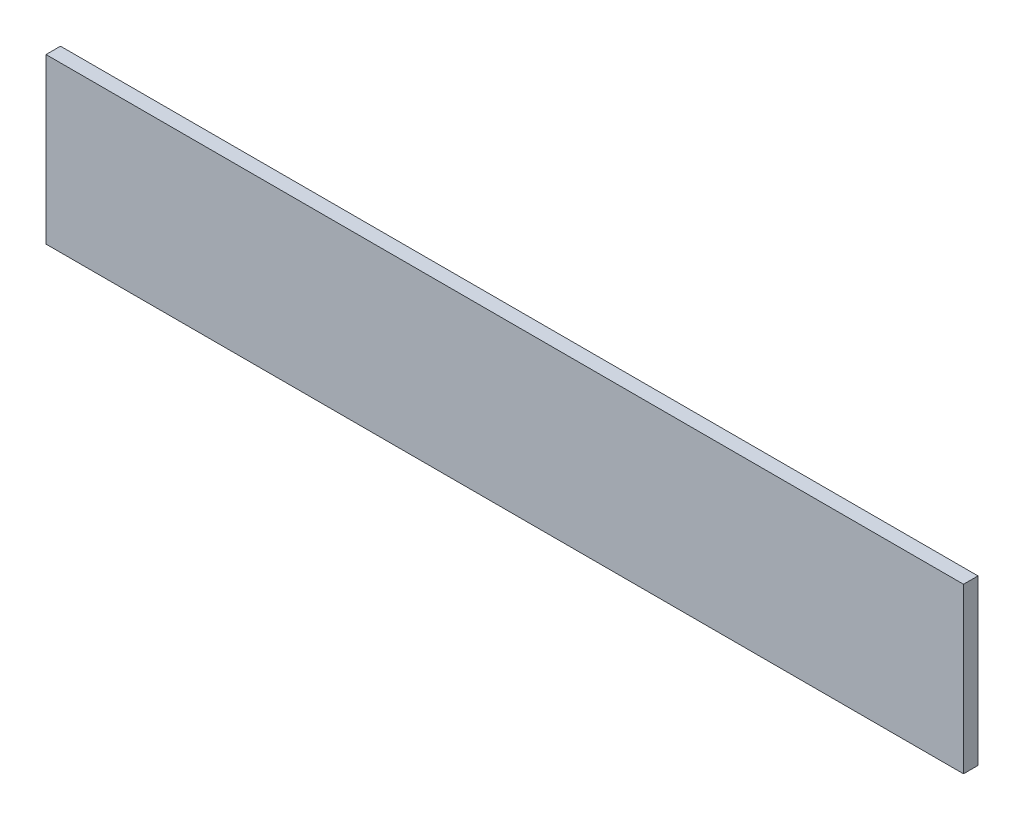
ISO-10303-21;
HEADER;
FILE_DESCRIPTION(('STEP AP214'),'2;1');
FILE_NAME('part.step','',(''),(''),'','','');
FILE_SCHEMA(('AUTOMOTIVE_DESIGN { 1 0 10303 214 1 1 1 1 }'));
ENDSEC;
DATA;
#1=APPLICATION_CONTEXT('core data for automotive mechanical design processes');
#2=APPLICATION_PROTOCOL_DEFINITION('international standard','automotive_design',2000,#1);
#3=PRODUCT_CONTEXT('',#1,'mechanical');
#4=PRODUCT('Part','Part','',(#3));
#5=PRODUCT_RELATED_PRODUCT_CATEGORY('part','',(#4));
#6=PRODUCT_DEFINITION_FORMATION('','',#4);
#7=PRODUCT_DEFINITION_CONTEXT('part definition',#1,'design');
#8=PRODUCT_DEFINITION('design','',#6,#7);
#9=PRODUCT_DEFINITION_SHAPE('','',#8);
#10=(LENGTH_UNIT() NAMED_UNIT(*) SI_UNIT(.MILLI.,.METRE.));
#11=(NAMED_UNIT(*) PLANE_ANGLE_UNIT() SI_UNIT($,.RADIAN.));
#12=(NAMED_UNIT(*) SI_UNIT($,.STERADIAN.) SOLID_ANGLE_UNIT());
#13=UNCERTAINTY_MEASURE_WITH_UNIT(LENGTH_MEASURE(1.E-05),#10,'distance_accuracy_value','');
#14=(GEOMETRIC_REPRESENTATION_CONTEXT(3) GLOBAL_UNCERTAINTY_ASSIGNED_CONTEXT((#13)) GLOBAL_UNIT_ASSIGNED_CONTEXT((#10,
#11,#12)) REPRESENTATION_CONTEXT('',''));
#15=CARTESIAN_POINT('',(0.,0.,0.));
#16=DIRECTION('',(0.,0.,1.));
#17=DIRECTION('',(1.,0.,0.));
#18=AXIS2_PLACEMENT_3D('',#15,#16,#17);
#19=CARTESIAN_POINT('',(0.,0.,-3.));
#20=DIRECTION('',(-1.,0.,0.));
#21=DIRECTION('',(0.,0.,1.));
#22=AXIS2_PLACEMENT_3D('',#19,#20,#21);
#23=PLANE('',#22);
#24=DIRECTION('',(0.,-1.,0.));
#25=VECTOR('',#24,1.);
#26=CARTESIAN_POINT('',(0.,0.,0.));
#27=LINE('',#26,#25);
#28=CARTESIAN_POINT('',(0.,34.,0.));
#29=VERTEX_POINT('',#28);
#30=CARTESIAN_POINT('',(0.,0.,0.));
#31=VERTEX_POINT('',#30);
#32=EDGE_CURVE('E99',#29,#31,#27,.T.);
#33=ORIENTED_EDGE('',*,*,#32,.F.);
#34=DIRECTION('',(0.,0.,1.));
#35=VECTOR('',#34,1.);
#36=CARTESIAN_POINT('',(0.,34.,-3.));
#37=LINE('',#36,#35);
#38=CARTESIAN_POINT('',(0.,34.,-3.));
#39=VERTEX_POINT('',#38);
#40=EDGE_CURVE('E11',#39,#29,#37,.T.);
#41=ORIENTED_EDGE('',*,*,#40,.F.);
#42=DIRECTION('',(0.,-1.,0.));
#43=VECTOR('',#42,1.);
#44=CARTESIAN_POINT('',(0.,0.,-3.));
#45=LINE('',#44,#43);
#46=CARTESIAN_POINT('',(0.,0.,-3.));
#47=VERTEX_POINT('',#46);
#48=EDGE_CURVE('E93',#39,#47,#45,.T.);
#49=ORIENTED_EDGE('',*,*,#48,.T.);
#50=DIRECTION('',(0.,0.,1.));
#51=VECTOR('',#50,1.);
#52=CARTESIAN_POINT('',(0.,0.,-3.));
#53=LINE('',#52,#51);
#54=EDGE_CURVE('E38',#47,#31,#53,.T.);
#55=ORIENTED_EDGE('',*,*,#54,.T.);
#56=EDGE_LOOP('',(#33,#41,#49,#55));
#57=FACE_BOUND('',#56,.T.);
#58=ADVANCED_FACE('F35',(#57),#23,.T.);
#59=CARTESIAN_POINT('',(0.,34.,-3.));
#60=DIRECTION('',(0.,1.,0.));
#61=DIRECTION('',(0.,0.,1.));
#62=AXIS2_PLACEMENT_3D('',#59,#60,#61);
#63=PLANE('',#62);
#64=DIRECTION('',(-1.,0.,0.));
#65=VECTOR('',#64,1.);
#66=CARTESIAN_POINT('',(0.,34.,0.));
#67=LINE('',#66,#65);
#68=CARTESIAN_POINT('',(190.,34.,0.));
#69=VERTEX_POINT('',#68);
#70=EDGE_CURVE('E95',#69,#29,#67,.T.);
#71=ORIENTED_EDGE('',*,*,#70,.F.);
#72=DIRECTION('',(0.,0.,1.));
#73=VECTOR('',#72,1.);
#74=CARTESIAN_POINT('',(190.,34.,-3.));
#75=LINE('',#74,#73);
#76=CARTESIAN_POINT('',(190.,34.,-3.));
#77=VERTEX_POINT('',#76);
#78=EDGE_CURVE('E44',#77,#69,#75,.T.);
#79=ORIENTED_EDGE('',*,*,#78,.F.);
#80=DIRECTION('',(-1.,0.,0.));
#81=VECTOR('',#80,1.);
#82=CARTESIAN_POINT('',(0.,34.,-3.));
#83=LINE('',#82,#81);
#84=EDGE_CURVE('E90',#77,#39,#83,.T.);
#85=ORIENTED_EDGE('',*,*,#84,.T.);
#86=ORIENTED_EDGE('',*,*,#40,.T.);
#87=EDGE_LOOP('',(#71,#79,#85,#86));
#88=FACE_BOUND('',#87,.T.);
#89=ADVANCED_FACE('F109',(#88),#63,.T.);
#90=CARTESIAN_POINT('',(190.,0.,-3.));
#91=DIRECTION('',(1.,0.,0.));
#92=DIRECTION('',(0.,0.,-1.));
#93=AXIS2_PLACEMENT_3D('',#90,#91,#92);
#94=PLANE('',#93);
#95=DIRECTION('',(0.,1.,0.));
#96=VECTOR('',#95,1.);
#97=CARTESIAN_POINT('',(190.,0.,0.));
#98=LINE('',#97,#96);
#99=CARTESIAN_POINT('',(190.,0.,0.));
#100=VERTEX_POINT('',#99);
#101=EDGE_CURVE('E85',#100,#69,#98,.T.);
#102=ORIENTED_EDGE('',*,*,#101,.F.);
#103=DIRECTION('',(0.,0.,1.));
#104=VECTOR('',#103,1.);
#105=CARTESIAN_POINT('',(190.,0.,-3.));
#106=LINE('',#105,#104);
#107=CARTESIAN_POINT('',(190.,0.,-3.));
#108=VERTEX_POINT('',#107);
#109=EDGE_CURVE('E80',#108,#100,#106,.T.);
#110=ORIENTED_EDGE('',*,*,#109,.F.);
#111=DIRECTION('',(0.,1.,0.));
#112=VECTOR('',#111,1.);
#113=CARTESIAN_POINT('',(190.,0.,-3.));
#114=LINE('',#113,#112);
#115=EDGE_CURVE('E83',#108,#77,#114,.T.);
#116=ORIENTED_EDGE('',*,*,#115,.T.);
#117=ORIENTED_EDGE('',*,*,#78,.T.);
#118=EDGE_LOOP('',(#102,#110,#116,#117));
#119=FACE_BOUND('',#118,.T.);
#120=ADVANCED_FACE('F82',(#119),#94,.T.);
#121=CARTESIAN_POINT('',(0.,0.,-3.));
#122=DIRECTION('',(0.,-1.,0.));
#123=DIRECTION('',(0.,0.,-1.));
#124=AXIS2_PLACEMENT_3D('',#121,#122,#123);
#125=PLANE('',#124);
#126=DIRECTION('',(1.,0.,0.));
#127=VECTOR('',#126,1.);
#128=CARTESIAN_POINT('',(0.,0.,0.));
#129=LINE('',#128,#127);
#130=EDGE_CURVE('E102',#31,#100,#129,.T.);
#131=ORIENTED_EDGE('',*,*,#130,.F.);
#132=ORIENTED_EDGE('',*,*,#54,.F.);
#133=DIRECTION('',(1.,0.,0.));
#134=VECTOR('',#133,1.);
#135=CARTESIAN_POINT('',(0.,0.,-3.));
#136=LINE('',#135,#134);
#137=EDGE_CURVE('E89',#47,#108,#136,.T.);
#138=ORIENTED_EDGE('',*,*,#137,.T.);
#139=ORIENTED_EDGE('',*,*,#109,.T.);
#140=EDGE_LOOP('',(#131,#132,#138,#139));
#141=FACE_BOUND('',#140,.T.);
#142=ADVANCED_FACE('F92',(#141),#125,.T.);
#143=CARTESIAN_POINT('',(0.,0.,-3.));
#144=DIRECTION('',(0.,0.,-1.));
#145=DIRECTION('',(-1.,0.,0.));
#146=AXIS2_PLACEMENT_3D('',#143,#144,#145);
#147=PLANE('',#146);
#148=ORIENTED_EDGE('',*,*,#48,.F.);
#149=ORIENTED_EDGE('',*,*,#84,.F.);
#150=ORIENTED_EDGE('',*,*,#115,.F.);
#151=ORIENTED_EDGE('',*,*,#137,.F.);
#152=EDGE_LOOP('',(#148,#149,#150,#151));
#153=FACE_BOUND('',#152,.T.);
#154=ADVANCED_FACE('F88',(#153),#147,.T.);
#155=CARTESIAN_POINT('',(0.,0.,0.));
#156=DIRECTION('',(0.,0.,-1.));
#157=DIRECTION('',(-1.,0.,0.));
#158=AXIS2_PLACEMENT_3D('',#155,#156,#157);
#159=PLANE('',#158);
#160=ORIENTED_EDGE('',*,*,#32,.T.);
#161=ORIENTED_EDGE('',*,*,#130,.T.);
#162=ORIENTED_EDGE('',*,*,#101,.T.);
#163=ORIENTED_EDGE('',*,*,#70,.T.);
#164=EDGE_LOOP('',(#160,#161,#162,#163));
#165=FACE_BOUND('',#164,.T.);
#166=ADVANCED_FACE('F108',(#165),#159,.F.);
#167=CLOSED_SHELL('',(#58,#89,#120,#142,#154,#166));
#168=MANIFOLD_SOLID_BREP('B2',#167);
#169=ADVANCED_BREP_SHAPE_REPRESENTATION('',(#18,#168),#14);
#170=SHAPE_DEFINITION_REPRESENTATION(#9,#169);
ENDSEC;
END-ISO-10303-21;
